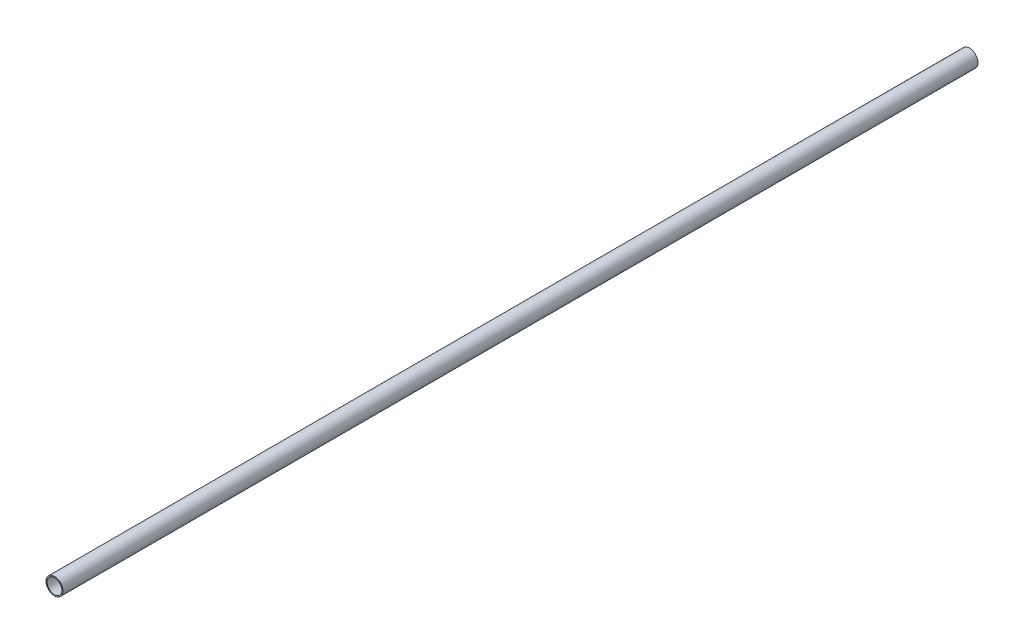
ISO-10303-21;
HEADER;
FILE_DESCRIPTION(('STEP AP214'),'2;1');
FILE_NAME('part.step','',(''),(''),'','','');
FILE_SCHEMA(('AUTOMOTIVE_DESIGN { 1 0 10303 214 1 1 1 1 }'));
ENDSEC;
DATA;
#1=APPLICATION_CONTEXT('core data for automotive mechanical design processes');
#2=APPLICATION_PROTOCOL_DEFINITION('international standard','automotive_design',2000,#1);
#3=PRODUCT_CONTEXT('',#1,'mechanical');
#4=PRODUCT('Part','Part','',(#3));
#5=PRODUCT_RELATED_PRODUCT_CATEGORY('part','',(#4));
#6=PRODUCT_DEFINITION_FORMATION('','',#4);
#7=PRODUCT_DEFINITION_CONTEXT('part definition',#1,'design');
#8=PRODUCT_DEFINITION('design','',#6,#7);
#9=PRODUCT_DEFINITION_SHAPE('','',#8);
#10=(LENGTH_UNIT() NAMED_UNIT(*) SI_UNIT(.MILLI.,.METRE.));
#11=(NAMED_UNIT(*) PLANE_ANGLE_UNIT() SI_UNIT($,.RADIAN.));
#12=(NAMED_UNIT(*) SI_UNIT($,.STERADIAN.) SOLID_ANGLE_UNIT());
#13=UNCERTAINTY_MEASURE_WITH_UNIT(LENGTH_MEASURE(1.E-05),#10,'distance_accuracy_value','');
#14=(GEOMETRIC_REPRESENTATION_CONTEXT(3) GLOBAL_UNCERTAINTY_ASSIGNED_CONTEXT((#13)) GLOBAL_UNIT_ASSIGNED_CONTEXT((#10,
#11,#12)) REPRESENTATION_CONTEXT('',''));
#15=CARTESIAN_POINT('',(0.,0.,0.));
#16=DIRECTION('',(0.,0.,1.));
#17=DIRECTION('',(1.,0.,0.));
#18=AXIS2_PLACEMENT_3D('',#15,#16,#17);
#19=CARTESIAN_POINT('',(0.,0.,1371.6));
#20=DIRECTION('',(0.,0.,1.));
#21=DIRECTION('',(1.,0.,0.));
#22=AXIS2_PLACEMENT_3D('',#19,#20,#21);
#23=PLANE('',#22);
#24=CARTESIAN_POINT('',(0.,0.,1371.6));
#25=DIRECTION('',(0.,0.,1.));
#26=DIRECTION('',(1.,0.,0.));
#27=AXIS2_PLACEMENT_3D('',#24,#25,#26);
#28=CIRCLE('',#27,12.7);
#29=CARTESIAN_POINT('',(12.7,0.,1371.6));
#30=VERTEX_POINT('',#29);
#31=EDGE_CURVE('E10',#30,#30,#28,.T.);
#32=ORIENTED_EDGE('',*,*,#31,.T.);
#33=EDGE_LOOP('',(#32));
#34=FACE_BOUND('',#33,.T.);
#35=CARTESIAN_POINT('',(0.,0.,1371.6));
#36=DIRECTION('',(0.,0.,1.));
#37=DIRECTION('',(1.,0.,0.));
#38=AXIS2_PLACEMENT_3D('',#35,#36,#37);
#39=CIRCLE('',#38,11.049);
#40=CARTESIAN_POINT('',(11.049,0.,1371.6));
#41=VERTEX_POINT('',#40);
#42=EDGE_CURVE('E45',#41,#41,#39,.T.);
#43=ORIENTED_EDGE('',*,*,#42,.F.);
#44=EDGE_LOOP('',(#43));
#45=FACE_BOUND('',#44,.T.);
#46=ADVANCED_FACE('F34',(#34,#45),#23,.T.);
#47=CARTESIAN_POINT('',(0.,0.,0.));
#48=DIRECTION('',(0.,0.,1.));
#49=DIRECTION('',(1.,0.,0.));
#50=AXIS2_PLACEMENT_3D('',#47,#48,#49);
#51=PLANE('',#50);
#52=CARTESIAN_POINT('',(0.,0.,0.));
#53=DIRECTION('',(0.,0.,1.));
#54=DIRECTION('',(1.,0.,0.));
#55=AXIS2_PLACEMENT_3D('',#52,#53,#54);
#56=CIRCLE('',#55,12.7);
#57=CARTESIAN_POINT('',(12.7,0.,0.));
#58=VERTEX_POINT('',#57);
#59=EDGE_CURVE('E38',#58,#58,#56,.T.);
#60=ORIENTED_EDGE('',*,*,#59,.F.);
#61=EDGE_LOOP('',(#60));
#62=FACE_BOUND('',#61,.T.);
#63=CARTESIAN_POINT('',(0.,0.,0.));
#64=DIRECTION('',(0.,0.,1.));
#65=DIRECTION('',(1.,0.,0.));
#66=AXIS2_PLACEMENT_3D('',#63,#64,#65);
#67=CIRCLE('',#66,11.049);
#68=CARTESIAN_POINT('',(11.049,0.,0.));
#69=VERTEX_POINT('',#68);
#70=EDGE_CURVE('E47',#69,#69,#67,.T.);
#71=ORIENTED_EDGE('',*,*,#70,.T.);
#72=EDGE_LOOP('',(#71));
#73=FACE_BOUND('',#72,.T.);
#74=ADVANCED_FACE('F57',(#62,#73),#51,.F.);
#75=CARTESIAN_POINT('',(0.,0.,1371.6));
#76=DIRECTION('',(0.,0.,-1.));
#77=DIRECTION('',(-1.,0.,0.));
#78=AXIS2_PLACEMENT_3D('',#75,#76,#77);
#79=CYLINDRICAL_SURFACE('',#78,12.7);
#80=ORIENTED_EDGE('',*,*,#31,.F.);
#81=EDGE_LOOP('',(#80));
#82=FACE_BOUND('',#81,.T.);
#83=ORIENTED_EDGE('',*,*,#59,.T.);
#84=EDGE_LOOP('',(#83));
#85=FACE_BOUND('',#84,.T.);
#86=ADVANCED_FACE('F36',(#82,#85),#79,.T.);
#87=CARTESIAN_POINT('',(0.,0.,1371.6));
#88=DIRECTION('',(0.,0.,-1.));
#89=DIRECTION('',(-1.,0.,0.));
#90=AXIS2_PLACEMENT_3D('',#87,#88,#89);
#91=CYLINDRICAL_SURFACE('',#90,11.049);
#92=ORIENTED_EDGE('',*,*,#42,.T.);
#93=EDGE_LOOP('',(#92));
#94=FACE_BOUND('',#93,.T.);
#95=ORIENTED_EDGE('',*,*,#70,.F.);
#96=EDGE_LOOP('',(#95));
#97=FACE_BOUND('',#96,.T.);
#98=ADVANCED_FACE('F53',(#94,#97),#91,.F.);
#99=CLOSED_SHELL('',(#46,#74,#86,#98));
#100=MANIFOLD_SOLID_BREP('B2',#99);
#101=ADVANCED_BREP_SHAPE_REPRESENTATION('',(#18,#100),#14);
#102=SHAPE_DEFINITION_REPRESENTATION(#9,#101);
ENDSEC;
END-ISO-10303-21;
